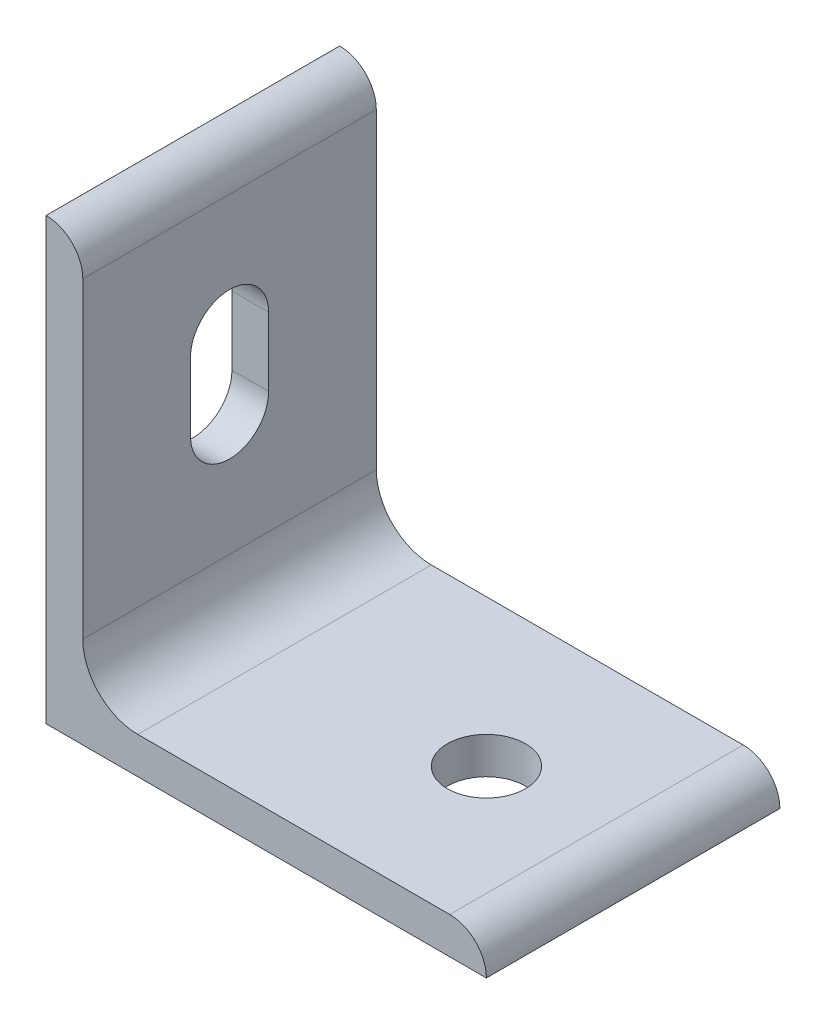
ISO-10303-21;
HEADER;
FILE_DESCRIPTION(('STEP AP214'),'2;1');
FILE_NAME('part.step','',(''),(''),'','','');
FILE_SCHEMA(('AUTOMOTIVE_DESIGN { 1 0 10303 214 1 1 1 1 }'));
ENDSEC;
DATA;
#1=APPLICATION_CONTEXT('core data for automotive mechanical design processes');
#2=APPLICATION_PROTOCOL_DEFINITION('international standard','automotive_design',2000,#1);
#3=PRODUCT_CONTEXT('',#1,'mechanical');
#4=PRODUCT('Part','Part','',(#3));
#5=PRODUCT_RELATED_PRODUCT_CATEGORY('part','',(#4));
#6=PRODUCT_DEFINITION_FORMATION('','',#4);
#7=PRODUCT_DEFINITION_CONTEXT('part definition',#1,'design');
#8=PRODUCT_DEFINITION('design','',#6,#7);
#9=PRODUCT_DEFINITION_SHAPE('','',#8);
#10=(LENGTH_UNIT() NAMED_UNIT(*) SI_UNIT(.MILLI.,.METRE.));
#11=(NAMED_UNIT(*) PLANE_ANGLE_UNIT() SI_UNIT($,.RADIAN.));
#12=(NAMED_UNIT(*) SI_UNIT($,.STERADIAN.) SOLID_ANGLE_UNIT());
#13=UNCERTAINTY_MEASURE_WITH_UNIT(LENGTH_MEASURE(1.E-05),#10,'distance_accuracy_value','');
#14=(GEOMETRIC_REPRESENTATION_CONTEXT(3) GLOBAL_UNCERTAINTY_ASSIGNED_CONTEXT((#13)) GLOBAL_UNIT_ASSIGNED_CONTEXT((#10,
#11,#12)) REPRESENTATION_CONTEXT('',''));
#15=CARTESIAN_POINT('',(0.,0.,0.));
#16=DIRECTION('',(0.,0.,1.));
#17=DIRECTION('',(1.,0.,0.));
#18=AXIS2_PLACEMENT_3D('',#15,#16,#17);
#19=CARTESIAN_POINT('',(38.1,0.,12.7));
#20=DIRECTION('',(0.,1.,0.));
#21=DIRECTION('',(-1.,0.,0.));
#22=AXIS2_PLACEMENT_3D('',#19,#20,#21);
#23=PLANE('',#22);
#24=CARTESIAN_POINT('',(25.40508,0.,0.));
#25=DIRECTION('',(0.,1.,0.));
#26=DIRECTION('',(0.,0.,1.));
#27=AXIS2_PLACEMENT_3D('',#24,#25,#26);
#28=CIRCLE('',#27,3.3782);
#29=CARTESIAN_POINT('',(25.40508,0.,3.3782));
#30=VERTEX_POINT('',#29);
#31=EDGE_CURVE('E236',#30,#30,#28,.T.);
#32=ORIENTED_EDGE('',*,*,#31,.T.);
#33=EDGE_LOOP('',(#32));
#34=FACE_BOUND('',#33,.T.);
#35=DIRECTION('',(1.,0.,0.));
#36=VECTOR('',#35,1.);
#37=CARTESIAN_POINT('',(38.1,0.,-12.7));
#38=LINE('',#37,#36);
#39=CARTESIAN_POINT('',(0.,0.,-12.7));
#40=VERTEX_POINT('',#39);
#41=CARTESIAN_POINT('',(38.1,0.,-12.7));
#42=VERTEX_POINT('',#41);
#43=EDGE_CURVE('E239',#40,#42,#38,.T.);
#44=ORIENTED_EDGE('',*,*,#43,.T.);
#45=DIRECTION('',(0.,0.,-1.));
#46=VECTOR('',#45,1.);
#47=CARTESIAN_POINT('',(38.1,0.,12.7));
#48=LINE('',#47,#46);
#49=CARTESIAN_POINT('',(38.1,0.,12.7));
#50=VERTEX_POINT('',#49);
#51=EDGE_CURVE('E13',#50,#42,#48,.T.);
#52=ORIENTED_EDGE('',*,*,#51,.F.);
#53=DIRECTION('',(1.,0.,0.));
#54=VECTOR('',#53,1.);
#55=CARTESIAN_POINT('',(38.1,0.,12.7));
#56=LINE('',#55,#54);
#57=CARTESIAN_POINT('',(0.,0.,12.7));
#58=VERTEX_POINT('',#57);
#59=EDGE_CURVE('E240',#58,#50,#56,.T.);
#60=ORIENTED_EDGE('',*,*,#59,.F.);
#61=DIRECTION('',(0.,0.,-1.));
#62=VECTOR('',#61,1.);
#63=CARTESIAN_POINT('',(0.,0.,12.7));
#64=LINE('',#63,#62);
#65=EDGE_CURVE('E260',#58,#40,#64,.T.);
#66=ORIENTED_EDGE('',*,*,#65,.T.);
#67=EDGE_LOOP('',(#44,#52,#60,#66));
#68=FACE_BOUND('',#67,.T.);
#69=ADVANCED_FACE('F108',(#34,#68),#23,.F.);
#70=CARTESIAN_POINT('',(38.1,0.00508000000000156,12.7));
#71=DIRECTION('',(-1.,0.,0.));
#72=DIRECTION('',(0.,0.,1.));
#73=AXIS2_PLACEMENT_3D('',#70,#71,#72);
#74=PLANE('',#73);
#75=DIRECTION('',(0.,1.,0.));
#76=VECTOR('',#75,1.);
#77=CARTESIAN_POINT('',(38.1,0.00508000000000156,-12.7));
#78=LINE('',#77,#76);
#79=CARTESIAN_POINT('',(38.1,0.00508000000000156,-12.7));
#80=VERTEX_POINT('',#79);
#81=EDGE_CURVE('E263',#42,#80,#78,.T.);
#82=ORIENTED_EDGE('',*,*,#81,.T.);
#83=DIRECTION('',(0.,0.,-1.));
#84=VECTOR('',#83,1.);
#85=CARTESIAN_POINT('',(38.1,0.00508000000000156,12.7));
#86=LINE('',#85,#84);
#87=CARTESIAN_POINT('',(38.1,0.00508000000000156,12.7));
#88=VERTEX_POINT('',#87);
#89=EDGE_CURVE('E115',#88,#80,#86,.T.);
#90=ORIENTED_EDGE('',*,*,#89,.F.);
#91=DIRECTION('',(0.,1.,0.));
#92=VECTOR('',#91,1.);
#93=CARTESIAN_POINT('',(38.1,0.00508000000000156,12.7));
#94=LINE('',#93,#92);
#95=EDGE_CURVE('E243',#50,#88,#94,.T.);
#96=ORIENTED_EDGE('',*,*,#95,.F.);
#97=ORIENTED_EDGE('',*,*,#51,.T.);
#98=EDGE_LOOP('',(#82,#90,#96,#97));
#99=FACE_BOUND('',#98,.T.);
#100=ADVANCED_FACE('F325',(#99),#74,.F.);
#101=CARTESIAN_POINT('',(34.93008,0.00508000000000117,12.7));
#102=DIRECTION('',(0.,0.,-1.));
#103=DIRECTION('',(-1.,0.,0.));
#104=AXIS2_PLACEMENT_3D('',#101,#102,#103);
#105=CYLINDRICAL_SURFACE('',#104,3.16992);
#106=CARTESIAN_POINT('',(34.93008,0.00508000000000117,-12.7));
#107=DIRECTION('',(0.,0.,1.));
#108=DIRECTION('',(1.,0.,0.));
#109=AXIS2_PLACEMENT_3D('',#106,#107,#108);
#110=CIRCLE('',#109,3.16992);
#111=CARTESIAN_POINT('',(34.93008,3.175,-12.7));
#112=VERTEX_POINT('',#111);
#113=EDGE_CURVE('E265',#80,#112,#110,.T.);
#114=ORIENTED_EDGE('',*,*,#113,.T.);
#115=DIRECTION('',(0.,0.,-1.));
#116=VECTOR('',#115,1.);
#117=CARTESIAN_POINT('',(34.93008,3.175,12.7));
#118=LINE('',#117,#116);
#119=CARTESIAN_POINT('',(34.93008,3.175,12.7));
#120=VERTEX_POINT('',#119);
#121=EDGE_CURVE('E295',#120,#112,#118,.T.);
#122=ORIENTED_EDGE('',*,*,#121,.F.);
#123=CARTESIAN_POINT('',(34.93008,0.00508000000000117,12.7));
#124=DIRECTION('',(0.,0.,1.));
#125=DIRECTION('',(1.,0.,0.));
#126=AXIS2_PLACEMENT_3D('',#123,#124,#125);
#127=CIRCLE('',#126,3.16992);
#128=EDGE_CURVE('E246',#88,#120,#127,.T.);
#129=ORIENTED_EDGE('',*,*,#128,.F.);
#130=ORIENTED_EDGE('',*,*,#89,.T.);
#131=EDGE_LOOP('',(#114,#122,#129,#130));
#132=FACE_BOUND('',#131,.T.);
#133=ADVANCED_FACE('F302',(#132),#105,.T.);
#134=CARTESIAN_POINT('',(7.93750000000001,3.175,12.7));
#135=DIRECTION('',(0.,-1.,0.));
#136=DIRECTION('',(1.,0.,0.));
#137=AXIS2_PLACEMENT_3D('',#134,#135,#136);
#138=PLANE('',#137);
#139=CARTESIAN_POINT('',(25.40508,3.175,0.));
#140=DIRECTION('',(0.,1.,0.));
#141=DIRECTION('',(0.,0.,1.));
#142=AXIS2_PLACEMENT_3D('',#139,#140,#141);
#143=CIRCLE('',#142,3.3782);
#144=CARTESIAN_POINT('',(25.40508,3.175,3.3782));
#145=VERTEX_POINT('',#144);
#146=EDGE_CURVE('E233',#145,#145,#143,.T.);
#147=ORIENTED_EDGE('',*,*,#146,.F.);
#148=EDGE_LOOP('',(#147));
#149=FACE_BOUND('',#148,.T.);
#150=DIRECTION('',(-1.,0.,0.));
#151=VECTOR('',#150,1.);
#152=CARTESIAN_POINT('',(7.93750000000001,3.175,-12.7));
#153=LINE('',#152,#151);
#154=CARTESIAN_POINT('',(7.93750000000001,3.17499999999999,-12.7));
#155=VERTEX_POINT('',#154);
#156=EDGE_CURVE('E267',#112,#155,#153,.T.);
#157=ORIENTED_EDGE('',*,*,#156,.T.);
#158=DIRECTION('',(0.,0.,-1.));
#159=VECTOR('',#158,1.);
#160=CARTESIAN_POINT('',(7.93750000000001,3.17499999999999,12.7));
#161=LINE('',#160,#159);
#162=CARTESIAN_POINT('',(7.93750000000001,3.17499999999999,12.7));
#163=VERTEX_POINT('',#162);
#164=EDGE_CURVE('E292',#163,#155,#161,.T.);
#165=ORIENTED_EDGE('',*,*,#164,.F.);
#166=DIRECTION('',(-1.,0.,0.));
#167=VECTOR('',#166,1.);
#168=CARTESIAN_POINT('',(7.93750000000001,3.175,12.7));
#169=LINE('',#168,#167);
#170=EDGE_CURVE('E248',#120,#163,#169,.T.);
#171=ORIENTED_EDGE('',*,*,#170,.F.);
#172=ORIENTED_EDGE('',*,*,#121,.T.);
#173=EDGE_LOOP('',(#157,#165,#171,#172));
#174=FACE_BOUND('',#173,.T.);
#175=ADVANCED_FACE('F313',(#149,#174),#138,.F.);
#176=CARTESIAN_POINT('',(7.93750000000001,7.93749999999999,12.7));
#177=DIRECTION('',(0.,0.,-1.));
#178=DIRECTION('',(-1.,0.,0.));
#179=AXIS2_PLACEMENT_3D('',#176,#177,#178);
#180=CYLINDRICAL_SURFACE('',#179,4.7625);
#181=CARTESIAN_POINT('',(7.93750000000001,7.93749999999999,-12.7));
#182=DIRECTION('',(0.,0.,-1.));
#183=DIRECTION('',(-1.,0.,0.));
#184=AXIS2_PLACEMENT_3D('',#181,#182,#183);
#185=CIRCLE('',#184,4.7625);
#186=CARTESIAN_POINT('',(3.175,7.9375,-12.7));
#187=VERTEX_POINT('',#186);
#188=EDGE_CURVE('E269',#155,#187,#185,.T.);
#189=ORIENTED_EDGE('',*,*,#188,.T.);
#190=DIRECTION('',(0.,0.,-1.));
#191=VECTOR('',#190,1.);
#192=CARTESIAN_POINT('',(3.175,7.9375,12.7));
#193=LINE('',#192,#191);
#194=CARTESIAN_POINT('',(3.175,7.9375,12.7));
#195=VERTEX_POINT('',#194);
#196=EDGE_CURVE('E289',#195,#187,#193,.T.);
#197=ORIENTED_EDGE('',*,*,#196,.F.);
#198=CARTESIAN_POINT('',(7.93750000000001,7.93749999999999,12.7));
#199=DIRECTION('',(0.,0.,-1.));
#200=DIRECTION('',(-1.,0.,0.));
#201=AXIS2_PLACEMENT_3D('',#198,#199,#200);
#202=CIRCLE('',#201,4.7625);
#203=EDGE_CURVE('E250',#163,#195,#202,.T.);
#204=ORIENTED_EDGE('',*,*,#203,.F.);
#205=ORIENTED_EDGE('',*,*,#164,.T.);
#206=EDGE_LOOP('',(#189,#197,#204,#205));
#207=FACE_BOUND('',#206,.T.);
#208=ADVANCED_FACE('F317',(#207),#180,.F.);
#209=CARTESIAN_POINT('',(3.175,34.93008,12.7));
#210=DIRECTION('',(-1.,0.,0.));
#211=DIRECTION('',(0.,-1.,0.));
#212=AXIS2_PLACEMENT_3D('',#209,#210,#211);
#213=PLANE('',#212);
#214=CARTESIAN_POINT('',(3.175,24.40559,0.));
#215=DIRECTION('',(1.,0.,0.));
#216=DIRECTION('',(0.,0.,-1.));
#217=AXIS2_PLACEMENT_3D('',#214,#215,#216);
#218=CIRCLE('',#217,3.37819999999999);
#219=CARTESIAN_POINT('',(3.175,24.40559,-3.37819999999999));
#220=VERTEX_POINT('',#219);
#221=CARTESIAN_POINT('',(3.175,24.40559,3.3782));
#222=VERTEX_POINT('',#221);
#223=EDGE_CURVE('E122',#220,#222,#218,.T.);
#224=ORIENTED_EDGE('',*,*,#223,.F.);
#225=DIRECTION('',(0.,-1.,0.));
#226=VECTOR('',#225,1.);
#227=CARTESIAN_POINT('',(3.175,24.40559,-3.37819999999999));
#228=LINE('',#227,#226);
#229=CARTESIAN_POINT('',(3.175,18.46199,-3.37819999999999));
#230=VERTEX_POINT('',#229);
#231=EDGE_CURVE('E202',#220,#230,#228,.T.);
#232=ORIENTED_EDGE('',*,*,#231,.T.);
#233=CARTESIAN_POINT('',(3.175,18.46199,0.));
#234=DIRECTION('',(1.,0.,0.));
#235=DIRECTION('',(0.,0.,-1.));
#236=AXIS2_PLACEMENT_3D('',#233,#234,#235);
#237=CIRCLE('',#236,3.37819999999999);
#238=CARTESIAN_POINT('',(3.175,18.46199,3.3782));
#239=VERTEX_POINT('',#238);
#240=EDGE_CURVE('E214',#239,#230,#237,.T.);
#241=ORIENTED_EDGE('',*,*,#240,.F.);
#242=DIRECTION('',(0.,-1.,0.));
#243=VECTOR('',#242,1.);
#244=CARTESIAN_POINT('',(3.175,24.40559,3.3782));
#245=LINE('',#244,#243);
#246=EDGE_CURVE('E220',#222,#239,#245,.T.);
#247=ORIENTED_EDGE('',*,*,#246,.F.);
#248=EDGE_LOOP('',(#224,#232,#241,#247));
#249=FACE_BOUND('',#248,.T.);
#250=DIRECTION('',(0.,1.,0.));
#251=VECTOR('',#250,1.);
#252=CARTESIAN_POINT('',(3.175,34.93008,-12.7));
#253=LINE('',#252,#251);
#254=CARTESIAN_POINT('',(3.175,34.93008,-12.7));
#255=VERTEX_POINT('',#254);
#256=EDGE_CURVE('E271',#187,#255,#253,.T.);
#257=ORIENTED_EDGE('',*,*,#256,.T.);
#258=DIRECTION('',(0.,0.,-1.));
#259=VECTOR('',#258,1.);
#260=CARTESIAN_POINT('',(3.175,34.93008,12.7));
#261=LINE('',#260,#259);
#262=CARTESIAN_POINT('',(3.175,34.93008,12.7));
#263=VERTEX_POINT('',#262);
#264=EDGE_CURVE('E286',#263,#255,#261,.T.);
#265=ORIENTED_EDGE('',*,*,#264,.F.);
#266=DIRECTION('',(0.,1.,0.));
#267=VECTOR('',#266,1.);
#268=CARTESIAN_POINT('',(3.175,34.93008,12.7));
#269=LINE('',#268,#267);
#270=EDGE_CURVE('E252',#195,#263,#269,.T.);
#271=ORIENTED_EDGE('',*,*,#270,.F.);
#272=ORIENTED_EDGE('',*,*,#196,.T.);
#273=EDGE_LOOP('',(#257,#265,#271,#272));
#274=FACE_BOUND('',#273,.T.);
#275=ADVANCED_FACE('F218',(#249,#274),#213,.F.);
#276=CARTESIAN_POINT('',(0.00508000000000019,34.93008,12.7));
#277=DIRECTION('',(0.,0.,-1.));
#278=DIRECTION('',(-1.,0.,0.));
#279=AXIS2_PLACEMENT_3D('',#276,#277,#278);
#280=CYLINDRICAL_SURFACE('',#279,3.16992);
#281=CARTESIAN_POINT('',(0.00508000000000019,34.93008,-12.7));
#282=DIRECTION('',(0.,0.,1.));
#283=DIRECTION('',(-1.,0.,0.));
#284=AXIS2_PLACEMENT_3D('',#281,#282,#283);
#285=CIRCLE('',#284,3.16992);
#286=CARTESIAN_POINT('',(0.00508,38.1,-12.7));
#287=VERTEX_POINT('',#286);
#288=EDGE_CURVE('E273',#255,#287,#285,.T.);
#289=ORIENTED_EDGE('',*,*,#288,.T.);
#290=DIRECTION('',(0.,0.,-1.));
#291=VECTOR('',#290,1.);
#292=CARTESIAN_POINT('',(0.00508,38.1,12.7));
#293=LINE('',#292,#291);
#294=CARTESIAN_POINT('',(0.00508,38.1,12.7));
#295=VERTEX_POINT('',#294);
#296=EDGE_CURVE('E283',#295,#287,#293,.T.);
#297=ORIENTED_EDGE('',*,*,#296,.F.);
#298=CARTESIAN_POINT('',(0.00508000000000019,34.93008,12.7));
#299=DIRECTION('',(0.,0.,1.));
#300=DIRECTION('',(-1.,0.,0.));
#301=AXIS2_PLACEMENT_3D('',#298,#299,#300);
#302=CIRCLE('',#301,3.16992);
#303=EDGE_CURVE('E254',#263,#295,#302,.T.);
#304=ORIENTED_EDGE('',*,*,#303,.F.);
#305=ORIENTED_EDGE('',*,*,#264,.T.);
#306=EDGE_LOOP('',(#289,#297,#304,#305));
#307=FACE_BOUND('',#306,.T.);
#308=ADVANCED_FACE('F341',(#307),#280,.T.);
#309=CARTESIAN_POINT('',(0.,38.1,12.7));
#310=DIRECTION('',(0.,-1.,0.));
#311=DIRECTION('',(0.,0.,-1.));
#312=AXIS2_PLACEMENT_3D('',#309,#310,#311);
#313=PLANE('',#312);
#314=DIRECTION('',(-1.,0.,0.));
#315=VECTOR('',#314,1.);
#316=CARTESIAN_POINT('',(0.,38.1,-12.7));
#317=LINE('',#316,#315);
#318=CARTESIAN_POINT('',(0.,38.1,-12.7));
#319=VERTEX_POINT('',#318);
#320=EDGE_CURVE('E275',#287,#319,#317,.T.);
#321=ORIENTED_EDGE('',*,*,#320,.T.);
#322=DIRECTION('',(0.,0.,-1.));
#323=VECTOR('',#322,1.);
#324=CARTESIAN_POINT('',(0.,38.1,12.7));
#325=LINE('',#324,#323);
#326=CARTESIAN_POINT('',(0.,38.1,12.7));
#327=VERTEX_POINT('',#326);
#328=EDGE_CURVE('E280',#327,#319,#325,.T.);
#329=ORIENTED_EDGE('',*,*,#328,.F.);
#330=DIRECTION('',(-1.,0.,0.));
#331=VECTOR('',#330,1.);
#332=CARTESIAN_POINT('',(0.,38.1,12.7));
#333=LINE('',#332,#331);
#334=EDGE_CURVE('E256',#295,#327,#333,.T.);
#335=ORIENTED_EDGE('',*,*,#334,.F.);
#336=ORIENTED_EDGE('',*,*,#296,.T.);
#337=EDGE_LOOP('',(#321,#329,#335,#336));
#338=FACE_BOUND('',#337,.T.);
#339=ADVANCED_FACE('F337',(#338),#313,.F.);
#340=CARTESIAN_POINT('',(0.,0.,12.7));
#341=DIRECTION('',(1.,0.,0.));
#342=DIRECTION('',(0.,0.,-1.));
#343=AXIS2_PLACEMENT_3D('',#340,#341,#342);
#344=PLANE('',#343);
#345=DIRECTION('',(0.,-1.,0.));
#346=VECTOR('',#345,1.);
#347=CARTESIAN_POINT('',(0.,24.40559,3.3782));
#348=LINE('',#347,#346);
#349=CARTESIAN_POINT('',(0.,24.40559,3.3782));
#350=VERTEX_POINT('',#349);
#351=CARTESIAN_POINT('',(0.,18.46199,3.3782));
#352=VERTEX_POINT('',#351);
#353=EDGE_CURVE('E481',#350,#352,#348,.T.);
#354=ORIENTED_EDGE('',*,*,#353,.T.);
#355=CARTESIAN_POINT('',(0.,18.46199,0.));
#356=DIRECTION('',(1.,0.,0.));
#357=DIRECTION('',(0.,0.,-1.));
#358=AXIS2_PLACEMENT_3D('',#355,#356,#357);
#359=CIRCLE('',#358,3.3782);
#360=CARTESIAN_POINT('',(0.,18.46199,-3.37819999999999));
#361=VERTEX_POINT('',#360);
#362=EDGE_CURVE('E227',#352,#361,#359,.T.);
#363=ORIENTED_EDGE('',*,*,#362,.T.);
#364=DIRECTION('',(0.,-1.,0.));
#365=VECTOR('',#364,1.);
#366=CARTESIAN_POINT('',(0.,24.40559,-3.37819999999999));
#367=LINE('',#366,#365);
#368=CARTESIAN_POINT('',(0.,24.40559,-3.3782));
#369=VERTEX_POINT('',#368);
#370=EDGE_CURVE('E211',#369,#361,#367,.T.);
#371=ORIENTED_EDGE('',*,*,#370,.F.);
#372=CARTESIAN_POINT('',(0.,24.40559,0.));
#373=DIRECTION('',(1.,0.,0.));
#374=DIRECTION('',(0.,0.,-1.));
#375=AXIS2_PLACEMENT_3D('',#372,#373,#374);
#376=CIRCLE('',#375,3.3782);
#377=EDGE_CURVE('E127',#369,#350,#376,.T.);
#378=ORIENTED_EDGE('',*,*,#377,.T.);
#379=EDGE_LOOP('',(#354,#363,#371,#378));
#380=FACE_BOUND('',#379,.T.);
#381=DIRECTION('',(0.,-1.,0.));
#382=VECTOR('',#381,1.);
#383=CARTESIAN_POINT('',(0.,0.,-12.7));
#384=LINE('',#383,#382);
#385=EDGE_CURVE('E244',#319,#40,#384,.T.);
#386=ORIENTED_EDGE('',*,*,#385,.T.);
#387=ORIENTED_EDGE('',*,*,#65,.F.);
#388=DIRECTION('',(0.,-1.,0.));
#389=VECTOR('',#388,1.);
#390=CARTESIAN_POINT('',(0.,0.,12.7));
#391=LINE('',#390,#389);
#392=EDGE_CURVE('E258',#327,#58,#391,.T.);
#393=ORIENTED_EDGE('',*,*,#392,.F.);
#394=ORIENTED_EDGE('',*,*,#328,.T.);
#395=EDGE_LOOP('',(#386,#387,#393,#394));
#396=FACE_BOUND('',#395,.T.);
#397=ADVANCED_FACE('F332',(#380,#396),#344,.F.);
#398=CARTESIAN_POINT('',(0.00508000000000019,34.93008,12.7));
#399=DIRECTION('',(0.,0.,-1.));
#400=DIRECTION('',(-1.,0.,0.));
#401=AXIS2_PLACEMENT_3D('',#398,#399,#400);
#402=PLANE('',#401);
#403=ORIENTED_EDGE('',*,*,#59,.T.);
#404=ORIENTED_EDGE('',*,*,#95,.T.);
#405=ORIENTED_EDGE('',*,*,#128,.T.);
#406=ORIENTED_EDGE('',*,*,#170,.T.);
#407=ORIENTED_EDGE('',*,*,#203,.T.);
#408=ORIENTED_EDGE('',*,*,#270,.T.);
#409=ORIENTED_EDGE('',*,*,#303,.T.);
#410=ORIENTED_EDGE('',*,*,#334,.T.);
#411=ORIENTED_EDGE('',*,*,#392,.T.);
#412=EDGE_LOOP('',(#403,#404,#405,#406,#407,#408,#409,#410,#411));
#413=FACE_BOUND('',#412,.T.);
#414=ADVANCED_FACE('F321',(#413),#402,.F.);
#415=CARTESIAN_POINT('',(0.00508000000000019,34.93008,-12.7));
#416=DIRECTION('',(0.,0.,-1.));
#417=DIRECTION('',(-1.,0.,0.));
#418=AXIS2_PLACEMENT_3D('',#415,#416,#417);
#419=PLANE('',#418);
#420=ORIENTED_EDGE('',*,*,#43,.F.);
#421=ORIENTED_EDGE('',*,*,#385,.F.);
#422=ORIENTED_EDGE('',*,*,#320,.F.);
#423=ORIENTED_EDGE('',*,*,#288,.F.);
#424=ORIENTED_EDGE('',*,*,#256,.F.);
#425=ORIENTED_EDGE('',*,*,#188,.F.);
#426=ORIENTED_EDGE('',*,*,#156,.F.);
#427=ORIENTED_EDGE('',*,*,#113,.F.);
#428=ORIENTED_EDGE('',*,*,#81,.F.);
#429=EDGE_LOOP('',(#420,#421,#422,#423,#424,#425,#426,#427,#428));
#430=FACE_BOUND('',#429,.T.);
#431=ADVANCED_FACE('F308',(#430),#419,.T.);
#432=CARTESIAN_POINT('',(25.40508,3.175,0.));
#433=DIRECTION('',(0.,1.,0.));
#434=DIRECTION('',(0.,0.,1.));
#435=AXIS2_PLACEMENT_3D('',#432,#433,#434);
#436=CYLINDRICAL_SURFACE('',#435,3.3782);
#437=ORIENTED_EDGE('',*,*,#31,.F.);
#438=EDGE_LOOP('',(#437));
#439=FACE_BOUND('',#438,.T.);
#440=ORIENTED_EDGE('',*,*,#146,.T.);
#441=EDGE_LOOP('',(#440));
#442=FACE_BOUND('',#441,.T.);
#443=ADVANCED_FACE('F357',(#439,#442),#436,.F.);
#444=CARTESIAN_POINT('',(3.175,18.46199,0.));
#445=DIRECTION('',(1.,0.,0.));
#446=DIRECTION('',(0.,0.,-1.));
#447=AXIS2_PLACEMENT_3D('',#444,#445,#446);
#448=CYLINDRICAL_SURFACE('',#447,3.37819999999999);
#449=ORIENTED_EDGE('',*,*,#240,.T.);
#450=DIRECTION('',(1.,0.,0.));
#451=VECTOR('',#450,1.);
#452=CARTESIAN_POINT('',(3.175,18.46199,-3.37819999999999));
#453=LINE('',#452,#451);
#454=EDGE_CURVE('E207',#361,#230,#453,.T.);
#455=ORIENTED_EDGE('',*,*,#454,.F.);
#456=ORIENTED_EDGE('',*,*,#362,.F.);
#457=DIRECTION('',(1.,0.,0.));
#458=VECTOR('',#457,1.);
#459=CARTESIAN_POINT('',(3.175,18.46199,3.3782));
#460=LINE('',#459,#458);
#461=EDGE_CURVE('E231',#239,#352,#460,.F.);
#462=ORIENTED_EDGE('',*,*,#461,.F.);
#463=EDGE_LOOP('',(#449,#455,#456,#462));
#464=FACE_BOUND('',#463,.T.);
#465=ADVANCED_FACE('F360',(#464),#448,.F.);
#466=CARTESIAN_POINT('',(3.175,24.40559,0.));
#467=DIRECTION('',(1.,0.,0.));
#468=DIRECTION('',(0.,0.,-1.));
#469=AXIS2_PLACEMENT_3D('',#466,#467,#468);
#470=CYLINDRICAL_SURFACE('',#469,3.37819999999999);
#471=ORIENTED_EDGE('',*,*,#223,.T.);
#472=DIRECTION('',(1.,0.,0.));
#473=VECTOR('',#472,1.);
#474=CARTESIAN_POINT('',(3.175,24.40559,3.3782));
#475=LINE('',#474,#473);
#476=EDGE_CURVE('E215',#350,#222,#475,.T.);
#477=ORIENTED_EDGE('',*,*,#476,.F.);
#478=ORIENTED_EDGE('',*,*,#377,.F.);
#479=DIRECTION('',(1.,0.,0.));
#480=VECTOR('',#479,1.);
#481=CARTESIAN_POINT('',(3.175,24.40559,-3.37819999999999));
#482=LINE('',#481,#480);
#483=EDGE_CURVE('E204',#220,#369,#482,.F.);
#484=ORIENTED_EDGE('',*,*,#483,.F.);
#485=EDGE_LOOP('',(#471,#477,#478,#484));
#486=FACE_BOUND('',#485,.T.);
#487=ADVANCED_FACE('F213',(#486),#470,.F.);
#488=CARTESIAN_POINT('',(3.175,24.40559,-3.37819999999999));
#489=DIRECTION('',(0.,0.,-1.));
#490=DIRECTION('',(-1.,0.,0.));
#491=AXIS2_PLACEMENT_3D('',#488,#489,#490);
#492=PLANE('',#491);
#493=ORIENTED_EDGE('',*,*,#454,.T.);
#494=ORIENTED_EDGE('',*,*,#231,.F.);
#495=ORIENTED_EDGE('',*,*,#483,.T.);
#496=ORIENTED_EDGE('',*,*,#370,.T.);
#497=EDGE_LOOP('',(#493,#494,#495,#496));
#498=FACE_BOUND('',#497,.T.);
#499=ADVANCED_FACE('F203',(#498),#492,.F.);
#500=CARTESIAN_POINT('',(3.175,24.40559,3.3782));
#501=DIRECTION('',(0.,0.,1.));
#502=DIRECTION('',(1.,0.,0.));
#503=AXIS2_PLACEMENT_3D('',#500,#501,#502);
#504=PLANE('',#503);
#505=ORIENTED_EDGE('',*,*,#461,.T.);
#506=ORIENTED_EDGE('',*,*,#353,.F.);
#507=ORIENTED_EDGE('',*,*,#476,.T.);
#508=ORIENTED_EDGE('',*,*,#246,.T.);
#509=EDGE_LOOP('',(#505,#506,#507,#508));
#510=FACE_BOUND('',#509,.T.);
#511=ADVANCED_FACE('F458',(#510),#504,.F.);
#512=CLOSED_SHELL('',(#69,#100,#133,#175,#208,#275,#308,#339,#397,#414,#431,#443,#465,#487,#499,#511));
#513=MANIFOLD_SOLID_BREP('B2',#512);
#514=ADVANCED_BREP_SHAPE_REPRESENTATION('',(#18,#513),#14);
#515=SHAPE_DEFINITION_REPRESENTATION(#9,#514);
ENDSEC;
END-ISO-10303-21;
